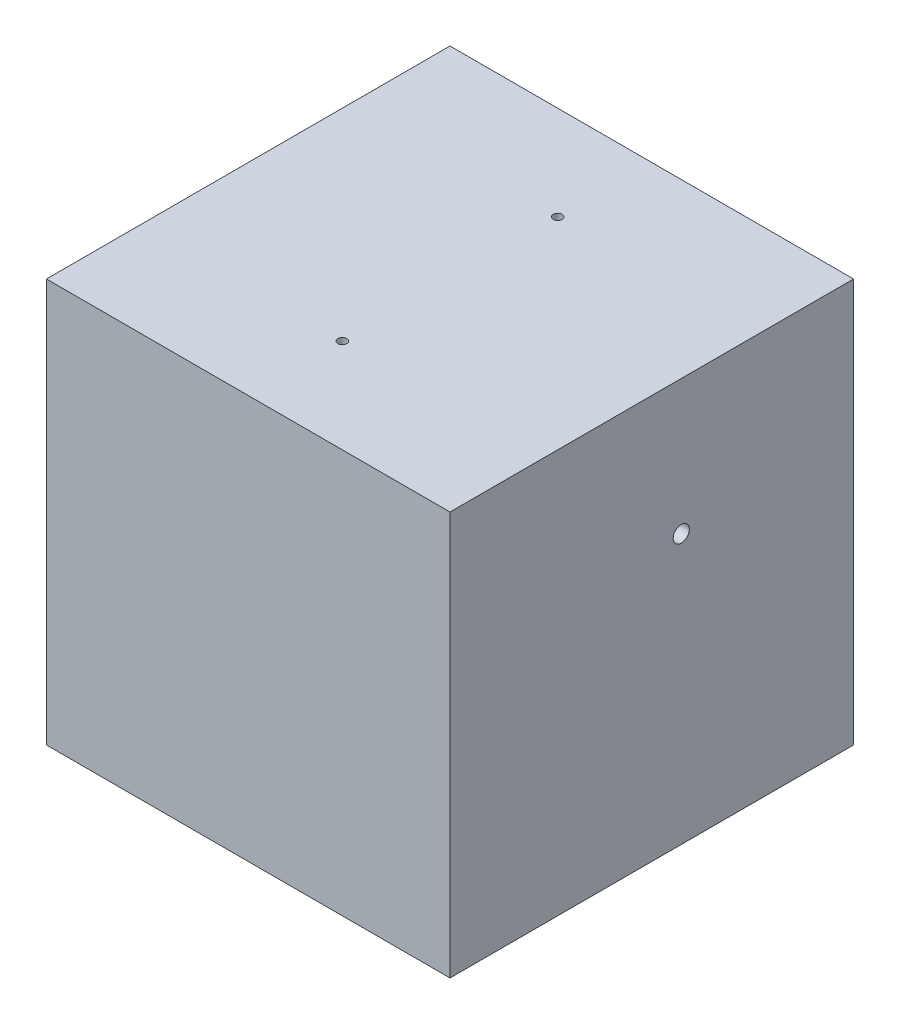
ISO-10303-21;
HEADER;
FILE_DESCRIPTION(('STEP AP214'),'2;1');
FILE_NAME('part.step','',(''),(''),'','','');
FILE_SCHEMA(('AUTOMOTIVE_DESIGN { 1 0 10303 214 1 1 1 1 }'));
ENDSEC;
DATA;
#1=APPLICATION_CONTEXT('core data for automotive mechanical design processes');
#2=APPLICATION_PROTOCOL_DEFINITION('international standard','automotive_design',2000,#1);
#3=PRODUCT_CONTEXT('',#1,'mechanical');
#4=PRODUCT('Part','Part','',(#3));
#5=PRODUCT_RELATED_PRODUCT_CATEGORY('part','',(#4));
#6=PRODUCT_DEFINITION_FORMATION('','',#4);
#7=PRODUCT_DEFINITION_CONTEXT('part definition',#1,'design');
#8=PRODUCT_DEFINITION('design','',#6,#7);
#9=PRODUCT_DEFINITION_SHAPE('','',#8);
#10=(LENGTH_UNIT() NAMED_UNIT(*) SI_UNIT(.MILLI.,.METRE.));
#11=(NAMED_UNIT(*) PLANE_ANGLE_UNIT() SI_UNIT($,.RADIAN.));
#12=(NAMED_UNIT(*) SI_UNIT($,.STERADIAN.) SOLID_ANGLE_UNIT());
#13=UNCERTAINTY_MEASURE_WITH_UNIT(LENGTH_MEASURE(1.E-05),#10,'distance_accuracy_value','');
#14=(GEOMETRIC_REPRESENTATION_CONTEXT(3) GLOBAL_UNCERTAINTY_ASSIGNED_CONTEXT((#13)) GLOBAL_UNIT_ASSIGNED_CONTEXT((#10,
#11,#12)) REPRESENTATION_CONTEXT('',''));
#15=CARTESIAN_POINT('',(0.,0.,0.));
#16=DIRECTION('',(0.,0.,1.));
#17=DIRECTION('',(1.,0.,0.));
#18=AXIS2_PLACEMENT_3D('',#15,#16,#17);
#19=CARTESIAN_POINT('',(0.,5.,0.));
#20=DIRECTION('',(1.,0.,0.));
#21=DIRECTION('',(0.,0.,-1.));
#22=AXIS2_PLACEMENT_3D('',#19,#20,#21);
#23=PLANE('',#22);
#24=CARTESIAN_POINT('',(0.,-45.,-85.95));
#25=DIRECTION('',(1.,0.,0.));
#26=DIRECTION('',(0.,0.,-1.));
#27=AXIS2_PLACEMENT_3D('',#24,#25,#26);
#28=CIRCLE('',#27,3.00000000000001);
#29=CARTESIAN_POINT('',(0.,-45.,-88.95));
#30=VERTEX_POINT('',#29);
#31=EDGE_CURVE('E213',#30,#30,#28,.T.);
#32=ORIENTED_EDGE('',*,*,#31,.T.);
#33=EDGE_LOOP('',(#32));
#34=FACE_BOUND('',#33,.T.);
#35=DIRECTION('',(0.,-1.,0.));
#36=VECTOR('',#35,1.);
#37=CARTESIAN_POINT('',(0.,5.,-150.));
#38=LINE('',#37,#36);
#39=CARTESIAN_POINT('',(0.,5.,-150.));
#40=VERTEX_POINT('',#39);
#41=CARTESIAN_POINT('',(0.,-145.,-150.));
#42=VERTEX_POINT('',#41);
#43=EDGE_CURVE('E100',#40,#42,#38,.T.);
#44=ORIENTED_EDGE('',*,*,#43,.T.);
#45=DIRECTION('',(0.,0.,-1.));
#46=VECTOR('',#45,1.);
#47=CARTESIAN_POINT('',(0.,-145.,0.));
#48=LINE('',#47,#46);
#49=CARTESIAN_POINT('',(0.,-145.,0.));
#50=VERTEX_POINT('',#49);
#51=EDGE_CURVE('E104',#50,#42,#48,.T.);
#52=ORIENTED_EDGE('',*,*,#51,.F.);
#53=DIRECTION('',(0.,-1.,0.));
#54=VECTOR('',#53,1.);
#55=CARTESIAN_POINT('',(0.,5.,0.));
#56=LINE('',#55,#54);
#57=CARTESIAN_POINT('',(0.,5.,0.));
#58=VERTEX_POINT('',#57);
#59=EDGE_CURVE('E11',#58,#50,#56,.T.);
#60=ORIENTED_EDGE('',*,*,#59,.F.);
#61=DIRECTION('',(0.,0.,1.));
#62=VECTOR('',#61,1.);
#63=CARTESIAN_POINT('',(0.,5.,0.));
#64=LINE('',#63,#62);
#65=EDGE_CURVE('E106',#40,#58,#64,.T.);
#66=ORIENTED_EDGE('',*,*,#65,.F.);
#67=EDGE_LOOP('',(#44,#52,#60,#66));
#68=FACE_BOUND('',#67,.T.);
#69=ADVANCED_FACE('F37',(#34,#68),#23,.F.);
#70=CARTESIAN_POINT('',(0.,5.,0.));
#71=DIRECTION('',(0.,0.,-1.));
#72=DIRECTION('',(-1.,0.,0.));
#73=AXIS2_PLACEMENT_3D('',#70,#71,#72);
#74=PLANE('',#73);
#75=ORIENTED_EDGE('',*,*,#59,.T.);
#76=DIRECTION('',(-1.,0.,0.));
#77=VECTOR('',#76,1.);
#78=CARTESIAN_POINT('',(0.,-145.,0.));
#79=LINE('',#78,#77);
#80=CARTESIAN_POINT('',(150.,-145.,0.));
#81=VERTEX_POINT('',#80);
#82=EDGE_CURVE('E125',#81,#50,#79,.T.);
#83=ORIENTED_EDGE('',*,*,#82,.F.);
#84=DIRECTION('',(0.,-1.,0.));
#85=VECTOR('',#84,1.);
#86=CARTESIAN_POINT('',(150.,5.,0.));
#87=LINE('',#86,#85);
#88=CARTESIAN_POINT('',(150.,5.,0.));
#89=VERTEX_POINT('',#88);
#90=EDGE_CURVE('E45',#89,#81,#87,.T.);
#91=ORIENTED_EDGE('',*,*,#90,.F.);
#92=DIRECTION('',(1.,0.,0.));
#93=VECTOR('',#92,1.);
#94=CARTESIAN_POINT('',(0.,5.,0.));
#95=LINE('',#94,#93);
#96=EDGE_CURVE('E177',#58,#89,#95,.T.);
#97=ORIENTED_EDGE('',*,*,#96,.F.);
#98=EDGE_LOOP('',(#75,#83,#91,#97));
#99=FACE_BOUND('',#98,.T.);
#100=ADVANCED_FACE('F188',(#99),#74,.F.);
#101=CARTESIAN_POINT('',(150.,5.,0.));
#102=DIRECTION('',(-1.,0.,0.));
#103=DIRECTION('',(0.,0.,1.));
#104=AXIS2_PLACEMENT_3D('',#101,#102,#103);
#105=PLANE('',#104);
#106=CARTESIAN_POINT('',(150.,-45.,-85.95));
#107=DIRECTION('',(1.,0.,0.));
#108=DIRECTION('',(0.,0.,-1.));
#109=AXIS2_PLACEMENT_3D('',#106,#107,#108);
#110=CIRCLE('',#109,3.00000000000001);
#111=CARTESIAN_POINT('',(150.,-45.,-88.95));
#112=VERTEX_POINT('',#111);
#113=EDGE_CURVE('E215',#112,#112,#110,.T.);
#114=ORIENTED_EDGE('',*,*,#113,.F.);
#115=EDGE_LOOP('',(#114));
#116=FACE_BOUND('',#115,.T.);
#117=ORIENTED_EDGE('',*,*,#90,.T.);
#118=DIRECTION('',(0.,0.,1.));
#119=VECTOR('',#118,1.);
#120=CARTESIAN_POINT('',(150.,-145.,0.));
#121=LINE('',#120,#119);
#122=CARTESIAN_POINT('',(150.,-145.,-150.));
#123=VERTEX_POINT('',#122);
#124=EDGE_CURVE('E119',#123,#81,#121,.T.);
#125=ORIENTED_EDGE('',*,*,#124,.F.);
#126=DIRECTION('',(0.,-1.,0.));
#127=VECTOR('',#126,1.);
#128=CARTESIAN_POINT('',(150.,5.,-150.));
#129=LINE('',#128,#127);
#130=CARTESIAN_POINT('',(150.,5.,-150.));
#131=VERTEX_POINT('',#130);
#132=EDGE_CURVE('E109',#131,#123,#129,.T.);
#133=ORIENTED_EDGE('',*,*,#132,.F.);
#134=DIRECTION('',(0.,0.,-1.));
#135=VECTOR('',#134,1.);
#136=CARTESIAN_POINT('',(150.,5.,0.));
#137=LINE('',#136,#135);
#138=EDGE_CURVE('E179',#89,#131,#137,.T.);
#139=ORIENTED_EDGE('',*,*,#138,.F.);
#140=EDGE_LOOP('',(#117,#125,#133,#139));
#141=FACE_BOUND('',#140,.T.);
#142=ADVANCED_FACE('F186',(#116,#141),#105,.F.);
#143=CARTESIAN_POINT('',(0.,5.,-150.));
#144=DIRECTION('',(0.,0.,1.));
#145=DIRECTION('',(1.,0.,0.));
#146=AXIS2_PLACEMENT_3D('',#143,#144,#145);
#147=PLANE('',#146);
#148=ORIENTED_EDGE('',*,*,#132,.T.);
#149=DIRECTION('',(1.,0.,0.));
#150=VECTOR('',#149,1.);
#151=CARTESIAN_POINT('',(0.,-145.,-150.));
#152=LINE('',#151,#150);
#153=EDGE_CURVE('E113',#42,#123,#152,.T.);
#154=ORIENTED_EDGE('',*,*,#153,.F.);
#155=ORIENTED_EDGE('',*,*,#43,.F.);
#156=DIRECTION('',(-1.,0.,0.));
#157=VECTOR('',#156,1.);
#158=CARTESIAN_POINT('',(0.,5.,-150.));
#159=LINE('',#158,#157);
#160=EDGE_CURVE('E110',#131,#40,#159,.T.);
#161=ORIENTED_EDGE('',*,*,#160,.F.);
#162=EDGE_LOOP('',(#148,#154,#155,#161));
#163=FACE_BOUND('',#162,.T.);
#164=ADVANCED_FACE('F114',(#163),#147,.F.);
#165=CARTESIAN_POINT('',(0.,5.,0.));
#166=DIRECTION('',(0.,-1.,0.));
#167=DIRECTION('',(0.,0.,-1.));
#168=AXIS2_PLACEMENT_3D('',#165,#166,#167);
#169=PLANE('',#168);
#170=CARTESIAN_POINT('',(75.,5.,-115.));
#171=DIRECTION('',(0.,1.,0.));
#172=DIRECTION('',(0.,0.,1.));
#173=AXIS2_PLACEMENT_3D('',#170,#171,#172);
#174=CIRCLE('',#173,1.65);
#175=CARTESIAN_POINT('',(75.,5.,-113.35));
#176=VERTEX_POINT('',#175);
#177=EDGE_CURVE('E139',#176,#176,#174,.T.);
#178=ORIENTED_EDGE('',*,*,#177,.F.);
#179=EDGE_LOOP('',(#178));
#180=FACE_BOUND('',#179,.T.);
#181=CARTESIAN_POINT('',(75.,5.,-35.));
#182=DIRECTION('',(0.,1.,0.));
#183=DIRECTION('',(0.,0.,-1.));
#184=AXIS2_PLACEMENT_3D('',#181,#182,#183);
#185=CIRCLE('',#184,1.65);
#186=CARTESIAN_POINT('',(75.,5.,-36.65));
#187=VERTEX_POINT('',#186);
#188=EDGE_CURVE('E135',#187,#187,#185,.T.);
#189=ORIENTED_EDGE('',*,*,#188,.F.);
#190=EDGE_LOOP('',(#189));
#191=FACE_BOUND('',#190,.T.);
#192=ORIENTED_EDGE('',*,*,#65,.T.);
#193=ORIENTED_EDGE('',*,*,#96,.T.);
#194=ORIENTED_EDGE('',*,*,#138,.T.);
#195=ORIENTED_EDGE('',*,*,#160,.T.);
#196=EDGE_LOOP('',(#192,#193,#194,#195));
#197=FACE_BOUND('',#196,.T.);
#198=ADVANCED_FACE('F190',(#180,#191,#197),#169,.F.);
#199=CARTESIAN_POINT('',(145.,-140.,-4.99999999999999));
#200=DIRECTION('',(-1.,0.,0.));
#201=DIRECTION('',(0.,0.,1.));
#202=AXIS2_PLACEMENT_3D('',#199,#200,#201);
#203=PLANE('',#202);
#204=CARTESIAN_POINT('',(145.,-45.,-85.95));
#205=DIRECTION('',(-1.,0.,0.));
#206=DIRECTION('',(0.,0.,1.));
#207=AXIS2_PLACEMENT_3D('',#204,#205,#206);
#208=CIRCLE('',#207,3.00000000000001);
#209=CARTESIAN_POINT('',(145.,-45.,-82.95));
#210=VERTEX_POINT('',#209);
#211=EDGE_CURVE('E218',#210,#210,#208,.T.);
#212=ORIENTED_EDGE('',*,*,#211,.F.);
#213=EDGE_LOOP('',(#212));
#214=FACE_BOUND('',#213,.T.);
#215=DIRECTION('',(0.,0.,1.));
#216=VECTOR('',#215,1.);
#217=CARTESIAN_POINT('',(145.,0.,-4.99999999999999));
#218=LINE('',#217,#216);
#219=CARTESIAN_POINT('',(145.,0.,-145.));
#220=VERTEX_POINT('',#219);
#221=CARTESIAN_POINT('',(145.,0.,-4.99999999999999));
#222=VERTEX_POINT('',#221);
#223=EDGE_CURVE('E52',#220,#222,#218,.T.);
#224=ORIENTED_EDGE('',*,*,#223,.F.);
#225=DIRECTION('',(0.,1.,0.));
#226=VECTOR('',#225,1.);
#227=CARTESIAN_POINT('',(145.,-140.,-145.));
#228=LINE('',#227,#226);
#229=CARTESIAN_POINT('',(145.,-140.,-145.));
#230=VERTEX_POINT('',#229);
#231=EDGE_CURVE('E160',#230,#220,#228,.T.);
#232=ORIENTED_EDGE('',*,*,#231,.F.);
#233=DIRECTION('',(0.,0.,1.));
#234=VECTOR('',#233,1.);
#235=CARTESIAN_POINT('',(145.,-140.,-4.99999999999999));
#236=LINE('',#235,#234);
#237=CARTESIAN_POINT('',(145.,-140.,-4.99999999999999));
#238=VERTEX_POINT('',#237);
#239=EDGE_CURVE('E147',#230,#238,#236,.T.);
#240=ORIENTED_EDGE('',*,*,#239,.T.);
#241=DIRECTION('',(0.,1.,0.));
#242=VECTOR('',#241,1.);
#243=CARTESIAN_POINT('',(145.,-140.,-4.99999999999999));
#244=LINE('',#243,#242);
#245=EDGE_CURVE('E173',#238,#222,#244,.T.);
#246=ORIENTED_EDGE('',*,*,#245,.T.);
#247=EDGE_LOOP('',(#224,#232,#240,#246));
#248=FACE_BOUND('',#247,.T.);
#249=ADVANCED_FACE('F192',(#214,#248),#203,.T.);
#250=CARTESIAN_POINT('',(4.99999999999998,-140.,-4.99999999999999));
#251=DIRECTION('',(0.,0.,-1.));
#252=DIRECTION('',(-1.,0.,0.));
#253=AXIS2_PLACEMENT_3D('',#250,#251,#252);
#254=PLANE('',#253);
#255=DIRECTION('',(-1.,0.,0.));
#256=VECTOR('',#255,1.);
#257=CARTESIAN_POINT('',(4.99999999999998,0.,-4.99999999999999));
#258=LINE('',#257,#256);
#259=CARTESIAN_POINT('',(4.99999999999998,0.,-4.99999999999999));
#260=VERTEX_POINT('',#259);
#261=EDGE_CURVE('E56',#222,#260,#258,.T.);
#262=ORIENTED_EDGE('',*,*,#261,.F.);
#263=ORIENTED_EDGE('',*,*,#245,.F.);
#264=DIRECTION('',(-1.,0.,0.));
#265=VECTOR('',#264,1.);
#266=CARTESIAN_POINT('',(4.99999999999998,-140.,-4.99999999999999));
#267=LINE('',#266,#265);
#268=CARTESIAN_POINT('',(4.99999999999998,-140.,-4.99999999999999));
#269=VERTEX_POINT('',#268);
#270=EDGE_CURVE('E150',#238,#269,#267,.T.);
#271=ORIENTED_EDGE('',*,*,#270,.T.);
#272=DIRECTION('',(0.,1.,0.));
#273=VECTOR('',#272,1.);
#274=CARTESIAN_POINT('',(4.99999999999998,-140.,-4.99999999999999));
#275=LINE('',#274,#273);
#276=EDGE_CURVE('E171',#269,#260,#275,.T.);
#277=ORIENTED_EDGE('',*,*,#276,.T.);
#278=EDGE_LOOP('',(#262,#263,#271,#277));
#279=FACE_BOUND('',#278,.T.);
#280=ADVANCED_FACE('F199',(#279),#254,.T.);
#281=CARTESIAN_POINT('',(4.99999999999998,-140.,-4.99999999999999));
#282=DIRECTION('',(1.,0.,0.));
#283=DIRECTION('',(0.,0.,-1.));
#284=AXIS2_PLACEMENT_3D('',#281,#282,#283);
#285=PLANE('',#284);
#286=CARTESIAN_POINT('',(4.99999999999998,-45.,-85.95));
#287=DIRECTION('',(1.,0.,0.));
#288=DIRECTION('',(0.,0.,-1.));
#289=AXIS2_PLACEMENT_3D('',#286,#287,#288);
#290=CIRCLE('',#289,3.00000000000001);
#291=CARTESIAN_POINT('',(4.99999999999998,-45.,-88.95));
#292=VERTEX_POINT('',#291);
#293=EDGE_CURVE('E40',#292,#292,#290,.T.);
#294=ORIENTED_EDGE('',*,*,#293,.F.);
#295=EDGE_LOOP('',(#294));
#296=FACE_BOUND('',#295,.T.);
#297=DIRECTION('',(0.,0.,-1.));
#298=VECTOR('',#297,1.);
#299=CARTESIAN_POINT('',(4.99999999999998,0.,-4.99999999999999));
#300=LINE('',#299,#298);
#301=CARTESIAN_POINT('',(4.99999999999998,0.,-145.));
#302=VERTEX_POINT('',#301);
#303=EDGE_CURVE('E163',#260,#302,#300,.T.);
#304=ORIENTED_EDGE('',*,*,#303,.F.);
#305=ORIENTED_EDGE('',*,*,#276,.F.);
#306=DIRECTION('',(0.,0.,-1.));
#307=VECTOR('',#306,1.);
#308=CARTESIAN_POINT('',(4.99999999999998,-140.,-4.99999999999999));
#309=LINE('',#308,#307);
#310=CARTESIAN_POINT('',(4.99999999999998,-140.,-145.));
#311=VERTEX_POINT('',#310);
#312=EDGE_CURVE('E154',#269,#311,#309,.T.);
#313=ORIENTED_EDGE('',*,*,#312,.T.);
#314=DIRECTION('',(0.,1.,0.));
#315=VECTOR('',#314,1.);
#316=CARTESIAN_POINT('',(4.99999999999998,-140.,-145.));
#317=LINE('',#316,#315);
#318=EDGE_CURVE('E168',#311,#302,#317,.T.);
#319=ORIENTED_EDGE('',*,*,#318,.T.);
#320=EDGE_LOOP('',(#304,#305,#313,#319));
#321=FACE_BOUND('',#320,.T.);
#322=ADVANCED_FACE('F259',(#296,#321),#285,.T.);
#323=CARTESIAN_POINT('',(4.99999999999998,-140.,-145.));
#324=DIRECTION('',(0.,0.,1.));
#325=DIRECTION('',(1.,0.,0.));
#326=AXIS2_PLACEMENT_3D('',#323,#324,#325);
#327=PLANE('',#326);
#328=DIRECTION('',(1.,0.,0.));
#329=VECTOR('',#328,1.);
#330=CARTESIAN_POINT('',(4.99999999999998,0.,-145.));
#331=LINE('',#330,#329);
#332=EDGE_CURVE('E151',#302,#220,#331,.T.);
#333=ORIENTED_EDGE('',*,*,#332,.F.);
#334=ORIENTED_EDGE('',*,*,#318,.F.);
#335=DIRECTION('',(1.,0.,0.));
#336=VECTOR('',#335,1.);
#337=CARTESIAN_POINT('',(4.99999999999998,-140.,-145.));
#338=LINE('',#337,#336);
#339=EDGE_CURVE('E157',#311,#230,#338,.T.);
#340=ORIENTED_EDGE('',*,*,#339,.T.);
#341=ORIENTED_EDGE('',*,*,#231,.T.);
#342=EDGE_LOOP('',(#333,#334,#340,#341));
#343=FACE_BOUND('',#342,.T.);
#344=ADVANCED_FACE('F256',(#343),#327,.T.);
#345=CARTESIAN_POINT('',(0.,0.,0.));
#346=DIRECTION('',(0.,-1.,0.));
#347=DIRECTION('',(0.,0.,-1.));
#348=AXIS2_PLACEMENT_3D('',#345,#346,#347);
#349=PLANE('',#348);
#350=CARTESIAN_POINT('',(75.,0.,-115.));
#351=DIRECTION('',(0.,1.,0.));
#352=DIRECTION('',(0.,0.,1.));
#353=AXIS2_PLACEMENT_3D('',#350,#351,#352);
#354=CIRCLE('',#353,1.65);
#355=CARTESIAN_POINT('',(75.,0.,-113.35));
#356=VERTEX_POINT('',#355);
#357=EDGE_CURVE('E136',#356,#356,#354,.T.);
#358=ORIENTED_EDGE('',*,*,#357,.T.);
#359=EDGE_LOOP('',(#358));
#360=FACE_BOUND('',#359,.T.);
#361=CARTESIAN_POINT('',(75.,0.,-35.));
#362=DIRECTION('',(0.,1.,0.));
#363=DIRECTION('',(0.,0.,-1.));
#364=AXIS2_PLACEMENT_3D('',#361,#362,#363);
#365=CIRCLE('',#364,1.65);
#366=CARTESIAN_POINT('',(75.,0.,-36.65));
#367=VERTEX_POINT('',#366);
#368=EDGE_CURVE('E142',#367,#367,#365,.T.);
#369=ORIENTED_EDGE('',*,*,#368,.T.);
#370=EDGE_LOOP('',(#369));
#371=FACE_BOUND('',#370,.T.);
#372=ORIENTED_EDGE('',*,*,#223,.T.);
#373=ORIENTED_EDGE('',*,*,#261,.T.);
#374=ORIENTED_EDGE('',*,*,#303,.T.);
#375=ORIENTED_EDGE('',*,*,#332,.T.);
#376=EDGE_LOOP('',(#372,#373,#374,#375));
#377=FACE_BOUND('',#376,.T.);
#378=ADVANCED_FACE('F254',(#360,#371,#377),#349,.T.);
#379=CARTESIAN_POINT('',(75.,0.,-35.));
#380=DIRECTION('',(0.,1.,0.));
#381=DIRECTION('',(0.,0.,1.));
#382=AXIS2_PLACEMENT_3D('',#379,#380,#381);
#383=CYLINDRICAL_SURFACE('',#382,1.65);
#384=ORIENTED_EDGE('',*,*,#368,.F.);
#385=EDGE_LOOP('',(#384));
#386=FACE_BOUND('',#385,.T.);
#387=ORIENTED_EDGE('',*,*,#188,.T.);
#388=EDGE_LOOP('',(#387));
#389=FACE_BOUND('',#388,.T.);
#390=ADVANCED_FACE('F250',(#386,#389),#383,.F.);
#391=CARTESIAN_POINT('',(75.,0.,-115.));
#392=DIRECTION('',(0.,1.,0.));
#393=DIRECTION('',(0.,0.,1.));
#394=AXIS2_PLACEMENT_3D('',#391,#392,#393);
#395=CYLINDRICAL_SURFACE('',#394,1.65);
#396=ORIENTED_EDGE('',*,*,#357,.F.);
#397=EDGE_LOOP('',(#396));
#398=FACE_BOUND('',#397,.T.);
#399=ORIENTED_EDGE('',*,*,#177,.T.);
#400=EDGE_LOOP('',(#399));
#401=FACE_BOUND('',#400,.T.);
#402=ADVANCED_FACE('F246',(#398,#401),#395,.F.);
#403=CARTESIAN_POINT('',(0.,-145.,0.));
#404=DIRECTION('',(0.,-1.,0.));
#405=DIRECTION('',(0.,0.,-1.));
#406=AXIS2_PLACEMENT_3D('',#403,#404,#405);
#407=PLANE('',#406);
#408=ORIENTED_EDGE('',*,*,#51,.T.);
#409=ORIENTED_EDGE('',*,*,#153,.T.);
#410=ORIENTED_EDGE('',*,*,#124,.T.);
#411=ORIENTED_EDGE('',*,*,#82,.T.);
#412=EDGE_LOOP('',(#408,#409,#410,#411));
#413=FACE_BOUND('',#412,.T.);
#414=CARTESIAN_POINT('',(75.,-145.,-75.));
#415=DIRECTION('',(0.,-1.,0.));
#416=DIRECTION('',(0.,0.,-1.));
#417=AXIS2_PLACEMENT_3D('',#414,#415,#416);
#418=CIRCLE('',#417,50.);
#419=CARTESIAN_POINT('',(75.,-145.,-125.));
#420=VERTEX_POINT('',#419);
#421=EDGE_CURVE('E126',#420,#420,#418,.T.);
#422=ORIENTED_EDGE('',*,*,#421,.F.);
#423=EDGE_LOOP('',(#422));
#424=FACE_BOUND('',#423,.T.);
#425=ADVANCED_FACE('F122',(#413,#424),#407,.T.);
#426=CARTESIAN_POINT('',(0.,-140.,0.));
#427=DIRECTION('',(0.,-1.,0.));
#428=DIRECTION('',(0.,0.,-1.));
#429=AXIS2_PLACEMENT_3D('',#426,#427,#428);
#430=PLANE('',#429);
#431=ORIENTED_EDGE('',*,*,#239,.F.);
#432=ORIENTED_EDGE('',*,*,#339,.F.);
#433=ORIENTED_EDGE('',*,*,#312,.F.);
#434=ORIENTED_EDGE('',*,*,#270,.F.);
#435=EDGE_LOOP('',(#431,#432,#433,#434));
#436=FACE_BOUND('',#435,.T.);
#437=CARTESIAN_POINT('',(75.,-140.,-75.));
#438=DIRECTION('',(0.,-1.,0.));
#439=DIRECTION('',(0.,0.,-1.));
#440=AXIS2_PLACEMENT_3D('',#437,#438,#439);
#441=CIRCLE('',#440,50.);
#442=CARTESIAN_POINT('',(75.,-140.,-125.));
#443=VERTEX_POINT('',#442);
#444=EDGE_CURVE('E129',#443,#443,#441,.T.);
#445=ORIENTED_EDGE('',*,*,#444,.T.);
#446=EDGE_LOOP('',(#445));
#447=FACE_BOUND('',#446,.T.);
#448=ADVANCED_FACE('F228',(#436,#447),#430,.F.);
#449=CARTESIAN_POINT('',(75.,-145.,-75.));
#450=DIRECTION('',(0.,1.,0.));
#451=DIRECTION('',(0.,0.,1.));
#452=AXIS2_PLACEMENT_3D('',#449,#450,#451);
#453=CYLINDRICAL_SURFACE('',#452,50.);
#454=ORIENTED_EDGE('',*,*,#421,.T.);
#455=EDGE_LOOP('',(#454));
#456=FACE_BOUND('',#455,.T.);
#457=ORIENTED_EDGE('',*,*,#444,.F.);
#458=EDGE_LOOP('',(#457));
#459=FACE_BOUND('',#458,.T.);
#460=ADVANCED_FACE('F230',(#456,#459),#453,.F.);
#461=CARTESIAN_POINT('',(0.,-45.,-85.95));
#462=DIRECTION('',(1.,0.,0.));
#463=DIRECTION('',(0.,0.,-1.));
#464=AXIS2_PLACEMENT_3D('',#461,#462,#463);
#465=CYLINDRICAL_SURFACE('',#464,3.00000000000001);
#466=ORIENTED_EDGE('',*,*,#293,.T.);
#467=EDGE_LOOP('',(#466));
#468=FACE_BOUND('',#467,.T.);
#469=ORIENTED_EDGE('',*,*,#31,.F.);
#470=EDGE_LOOP('',(#469));
#471=FACE_BOUND('',#470,.T.);
#472=ADVANCED_FACE('F232',(#468,#471),#465,.F.);
#473=ORIENTED_EDGE('',*,*,#211,.T.);
#474=EDGE_LOOP('',(#473));
#475=FACE_BOUND('',#474,.T.);
#476=ORIENTED_EDGE('',*,*,#113,.T.);
#477=EDGE_LOOP('',(#476));
#478=FACE_BOUND('',#477,.T.);
#479=ADVANCED_FACE('F239',(#475,#478),#465,.F.);
#480=CLOSED_SHELL('',(#69,#100,#142,#164,#198,#249,#280,#322,#344,#378,#390,#402,#425,#448,#460,
#472,#479));
#481=MANIFOLD_SOLID_BREP('B2',#480);
#482=ADVANCED_BREP_SHAPE_REPRESENTATION('',(#18,#481),#14);
#483=SHAPE_DEFINITION_REPRESENTATION(#9,#482);
ENDSEC;
END-ISO-10303-21;
